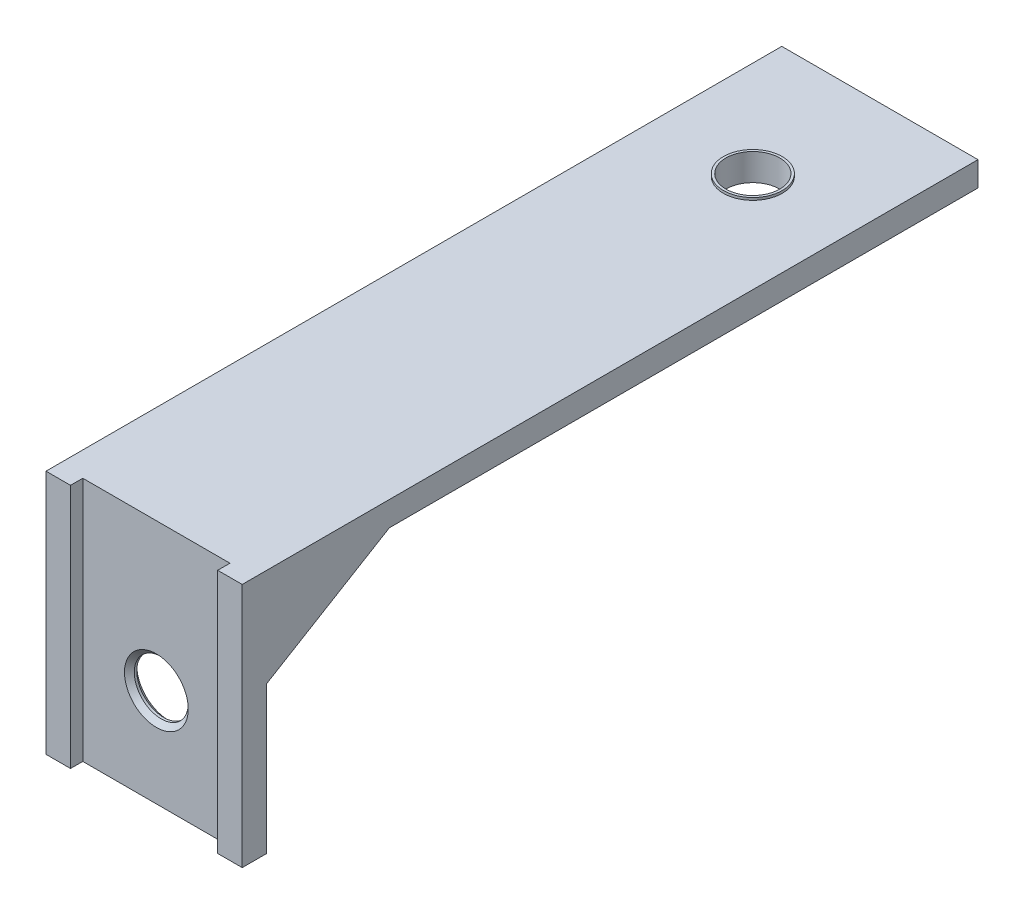
ISO-10303-21;
HEADER;
FILE_DESCRIPTION(('STEP AP214'),'2;1');
FILE_NAME('part.step','',(''),(''),'','','');
FILE_SCHEMA(('AUTOMOTIVE_DESIGN { 1 0 10303 214 1 1 1 1 }'));
ENDSEC;
DATA;
#1=APPLICATION_CONTEXT('core data for automotive mechanical design processes');
#2=APPLICATION_PROTOCOL_DEFINITION('international standard','automotive_design',2000,#1);
#3=PRODUCT_CONTEXT('',#1,'mechanical');
#4=PRODUCT('Part','Part','',(#3));
#5=PRODUCT_RELATED_PRODUCT_CATEGORY('part','',(#4));
#6=PRODUCT_DEFINITION_FORMATION('','',#4);
#7=PRODUCT_DEFINITION_CONTEXT('part definition',#1,'design');
#8=PRODUCT_DEFINITION('design','',#6,#7);
#9=PRODUCT_DEFINITION_SHAPE('','',#8);
#10=(LENGTH_UNIT() NAMED_UNIT(*) SI_UNIT(.MILLI.,.METRE.));
#11=(NAMED_UNIT(*) PLANE_ANGLE_UNIT() SI_UNIT($,.RADIAN.));
#12=(NAMED_UNIT(*) SI_UNIT($,.STERADIAN.) SOLID_ANGLE_UNIT());
#13=UNCERTAINTY_MEASURE_WITH_UNIT(LENGTH_MEASURE(1.E-05),#10,'distance_accuracy_value','');
#14=(GEOMETRIC_REPRESENTATION_CONTEXT(3) GLOBAL_UNCERTAINTY_ASSIGNED_CONTEXT((#13)) GLOBAL_UNIT_ASSIGNED_CONTEXT((#10,
#11,#12)) REPRESENTATION_CONTEXT('',''));
#15=CARTESIAN_POINT('',(0.,0.,0.));
#16=DIRECTION('',(0.,0.,1.));
#17=DIRECTION('',(1.,0.,0.));
#18=AXIS2_PLACEMENT_3D('',#15,#16,#17);
#19=CARTESIAN_POINT('',(40.,50.,0.));
#20=DIRECTION('',(0.,1.,0.));
#21=DIRECTION('',(0.,0.,1.));
#22=AXIS2_PLACEMENT_3D('',#19,#20,#21);
#23=PLANE('',#22);
#24=DIRECTION('',(-1.,0.,0.));
#25=VECTOR('',#24,1.);
#26=CARTESIAN_POINT('',(40.,50.,-150.));
#27=LINE('',#26,#25);
#28=CARTESIAN_POINT('',(40.,50.,-150.));
#29=VERTEX_POINT('',#28);
#30=CARTESIAN_POINT('',(0.,50.,-150.));
#31=VERTEX_POINT('',#30);
#32=EDGE_CURVE('E203',#29,#31,#27,.T.);
#33=ORIENTED_EDGE('',*,*,#32,.T.);
#34=DIRECTION('',(0.,0.,-1.));
#35=VECTOR('',#34,1.);
#36=CARTESIAN_POINT('',(0.,50.,0.));
#37=LINE('',#36,#35);
#38=CARTESIAN_POINT('',(0.,50.,0.));
#39=VERTEX_POINT('',#38);
#40=EDGE_CURVE('E178',#39,#31,#37,.T.);
#41=ORIENTED_EDGE('',*,*,#40,.F.);
#42=DIRECTION('',(-1.,0.,0.));
#43=VECTOR('',#42,1.);
#44=CARTESIAN_POINT('',(40.,50.,0.));
#45=LINE('',#44,#43);
#46=CARTESIAN_POINT('',(5.,50.,0.));
#47=VERTEX_POINT('',#46);
#48=EDGE_CURVE('E169',#47,#39,#45,.T.);
#49=ORIENTED_EDGE('',*,*,#48,.F.);
#50=DIRECTION('',(0.,0.,1.));
#51=VECTOR('',#50,1.);
#52=CARTESIAN_POINT('',(5.,50.,-2.5));
#53=LINE('',#52,#51);
#54=CARTESIAN_POINT('',(5.,50.,-2.5));
#55=VERTEX_POINT('',#54);
#56=EDGE_CURVE('E241',#55,#47,#53,.T.);
#57=ORIENTED_EDGE('',*,*,#56,.F.);
#58=DIRECTION('',(-1.,0.,0.));
#59=VECTOR('',#58,1.);
#60=CARTESIAN_POINT('',(35.,50.,-2.5));
#61=LINE('',#60,#59);
#62=CARTESIAN_POINT('',(35.,50.,-2.5));
#63=VERTEX_POINT('',#62);
#64=EDGE_CURVE('E233',#63,#55,#61,.T.);
#65=ORIENTED_EDGE('',*,*,#64,.F.);
#66=DIRECTION('',(0.,0.,-1.));
#67=VECTOR('',#66,1.);
#68=CARTESIAN_POINT('',(35.,50.,-2.5));
#69=LINE('',#68,#67);
#70=CARTESIAN_POINT('',(35.,50.,0.));
#71=VERTEX_POINT('',#70);
#72=EDGE_CURVE('E242',#71,#63,#69,.T.);
#73=ORIENTED_EDGE('',*,*,#72,.F.);
#74=CARTESIAN_POINT('',(40.,50.,0.));
#75=VERTEX_POINT('',#74);
#76=EDGE_CURVE('E206',#75,#71,#45,.T.);
#77=ORIENTED_EDGE('',*,*,#76,.F.);
#78=DIRECTION('',(0.,0.,-1.));
#79=VECTOR('',#78,1.);
#80=CARTESIAN_POINT('',(40.,50.,0.));
#81=LINE('',#80,#79);
#82=EDGE_CURVE('E264',#75,#29,#81,.T.);
#83=ORIENTED_EDGE('',*,*,#82,.T.);
#84=EDGE_LOOP('',(#33,#41,#49,#57,#65,#73,#77,#83));
#85=FACE_BOUND('',#84,.T.);
#86=CARTESIAN_POINT('',(20.,50.,-124.097336258444));
#87=DIRECTION('',(0.,1.,0.));
#88=DIRECTION('',(0.,0.,1.));
#89=AXIS2_PLACEMENT_3D('',#86,#87,#88);
#90=CIRCLE('',#89,6.);
#91=CARTESIAN_POINT('',(20.,50.,-118.097336258444));
#92=VERTEX_POINT('',#91);
#93=EDGE_CURVE('E354',#92,#92,#90,.T.);
#94=ORIENTED_EDGE('',*,*,#93,.F.);
#95=EDGE_LOOP('',(#94));
#96=FACE_BOUND('',#95,.T.);
#97=ADVANCED_FACE('F40',(#85,#96),#23,.T.);
#98=CARTESIAN_POINT('',(40.,0.,0.));
#99=DIRECTION('',(0.,0.,1.));
#100=DIRECTION('',(1.,0.,0.));
#101=AXIS2_PLACEMENT_3D('',#98,#99,#100);
#102=PLANE('',#101);
#103=DIRECTION('',(0.,1.,0.));
#104=VECTOR('',#103,1.);
#105=CARTESIAN_POINT('',(35.,0.,0.));
#106=LINE('',#105,#104);
#107=CARTESIAN_POINT('',(35.,0.,0.));
#108=VERTEX_POINT('',#107);
#109=EDGE_CURVE('E179',#108,#71,#106,.T.);
#110=ORIENTED_EDGE('',*,*,#109,.F.);
#111=DIRECTION('',(-1.,0.,0.));
#112=VECTOR('',#111,1.);
#113=CARTESIAN_POINT('',(40.,0.,0.));
#114=LINE('',#113,#112);
#115=CARTESIAN_POINT('',(40.,0.,0.));
#116=VERTEX_POINT('',#115);
#117=EDGE_CURVE('E191',#116,#108,#114,.T.);
#118=ORIENTED_EDGE('',*,*,#117,.F.);
#119=DIRECTION('',(0.,1.,0.));
#120=VECTOR('',#119,1.);
#121=CARTESIAN_POINT('',(40.,0.,0.));
#122=LINE('',#121,#120);
#123=EDGE_CURVE('E190',#116,#75,#122,.T.);
#124=ORIENTED_EDGE('',*,*,#123,.T.);
#125=ORIENTED_EDGE('',*,*,#76,.T.);
#126=EDGE_LOOP('',(#110,#118,#124,#125));
#127=FACE_BOUND('',#126,.T.);
#128=ADVANCED_FACE('F309',(#127),#102,.T.);
#129=DIRECTION('',(0.,1.,0.));
#130=VECTOR('',#129,1.);
#131=CARTESIAN_POINT('',(5.,0.,0.));
#132=LINE('',#131,#130);
#133=CARTESIAN_POINT('',(5.,0.,0.));
#134=VERTEX_POINT('',#133);
#135=EDGE_CURVE('E257',#134,#47,#132,.T.);
#136=ORIENTED_EDGE('',*,*,#135,.T.);
#137=ORIENTED_EDGE('',*,*,#48,.T.);
#138=DIRECTION('',(0.,1.,0.));
#139=VECTOR('',#138,1.);
#140=CARTESIAN_POINT('',(0.,0.,0.));
#141=LINE('',#140,#139);
#142=CARTESIAN_POINT('',(0.,0.,0.));
#143=VERTEX_POINT('',#142);
#144=EDGE_CURVE('E175',#143,#39,#141,.T.);
#145=ORIENTED_EDGE('',*,*,#144,.F.);
#146=EDGE_CURVE('E195',#134,#143,#114,.T.);
#147=ORIENTED_EDGE('',*,*,#146,.F.);
#148=EDGE_LOOP('',(#136,#137,#145,#147));
#149=FACE_BOUND('',#148,.T.);
#150=ADVANCED_FACE('F316',(#149),#102,.T.);
#151=CARTESIAN_POINT('',(40.,0.,0.));
#152=DIRECTION('',(0.,1.,0.));
#153=DIRECTION('',(0.,0.,1.));
#154=AXIS2_PLACEMENT_3D('',#151,#152,#153);
#155=PLANE('',#154);
#156=ORIENTED_EDGE('',*,*,#117,.T.);
#157=DIRECTION('',(0.,0.,-1.));
#158=VECTOR('',#157,1.);
#159=CARTESIAN_POINT('',(35.,0.,-2.5));
#160=LINE('',#159,#158);
#161=CARTESIAN_POINT('',(35.,0.,-2.5));
#162=VERTEX_POINT('',#161);
#163=EDGE_CURVE('E249',#108,#162,#160,.T.);
#164=ORIENTED_EDGE('',*,*,#163,.T.);
#165=DIRECTION('',(-1.,0.,0.));
#166=VECTOR('',#165,1.);
#167=CARTESIAN_POINT('',(35.,0.,-2.5));
#168=LINE('',#167,#166);
#169=CARTESIAN_POINT('',(5.,0.,-2.5));
#170=VERTEX_POINT('',#169);
#171=EDGE_CURVE('E252',#162,#170,#168,.T.);
#172=ORIENTED_EDGE('',*,*,#171,.T.);
#173=DIRECTION('',(0.,0.,1.));
#174=VECTOR('',#173,1.);
#175=CARTESIAN_POINT('',(5.,0.,-2.5));
#176=LINE('',#175,#174);
#177=EDGE_CURVE('E261',#170,#134,#176,.T.);
#178=ORIENTED_EDGE('',*,*,#177,.T.);
#179=ORIENTED_EDGE('',*,*,#146,.T.);
#180=DIRECTION('',(0.,0.,-1.));
#181=VECTOR('',#180,1.);
#182=CARTESIAN_POINT('',(0.,0.,0.));
#183=LINE('',#182,#181);
#184=CARTESIAN_POINT('',(0.,0.,-5.));
#185=VERTEX_POINT('',#184);
#186=EDGE_CURVE('E188',#143,#185,#183,.T.);
#187=ORIENTED_EDGE('',*,*,#186,.T.);
#188=DIRECTION('',(-1.,0.,0.));
#189=VECTOR('',#188,1.);
#190=CARTESIAN_POINT('',(40.,0.,-5.));
#191=LINE('',#190,#189);
#192=CARTESIAN_POINT('',(40.,0.,-5.));
#193=VERTEX_POINT('',#192);
#194=EDGE_CURVE('E196',#193,#185,#191,.T.);
#195=ORIENTED_EDGE('',*,*,#194,.F.);
#196=DIRECTION('',(0.,0.,-1.));
#197=VECTOR('',#196,1.);
#198=CARTESIAN_POINT('',(40.,0.,0.));
#199=LINE('',#198,#197);
#200=EDGE_CURVE('E165',#116,#193,#199,.T.);
#201=ORIENTED_EDGE('',*,*,#200,.F.);
#202=EDGE_LOOP('',(#156,#164,#172,#178,#179,#187,#195,#201));
#203=FACE_BOUND('',#202,.T.);
#204=ADVANCED_FACE('F311',(#203),#155,.F.);
#205=CARTESIAN_POINT('',(40.,0.,-5.));
#206=DIRECTION('',(0.,0.,1.));
#207=DIRECTION('',(1.,0.,0.));
#208=AXIS2_PLACEMENT_3D('',#205,#206,#207);
#209=PLANE('',#208);
#210=CARTESIAN_POINT('',(20.,20.,-5.));
#211=DIRECTION('',(0.,0.,1.));
#212=DIRECTION('',(1.,0.,0.));
#213=AXIS2_PLACEMENT_3D('',#210,#211,#212);
#214=CIRCLE('',#213,6.50000000000005);
#215=CARTESIAN_POINT('',(13.5,20.,-5.));
#216=VERTEX_POINT('',#215);
#217=EDGE_CURVE('E11',#216,#216,#214,.T.);
#218=ORIENTED_EDGE('',*,*,#217,.T.);
#219=EDGE_LOOP('',(#218));
#220=FACE_BOUND('',#219,.T.);
#221=DIRECTION('',(0.,1.,0.));
#222=VECTOR('',#221,1.);
#223=CARTESIAN_POINT('',(0.,0.,-5.));
#224=LINE('',#223,#222);
#225=CARTESIAN_POINT('',(0.,30.,-5.));
#226=VERTEX_POINT('',#225);
#227=EDGE_CURVE('E186',#185,#226,#224,.T.);
#228=ORIENTED_EDGE('',*,*,#227,.T.);
#229=DIRECTION('',(-1.,0.,0.));
#230=VECTOR('',#229,1.);
#231=CARTESIAN_POINT('',(0.,30.,-5.));
#232=LINE('',#231,#230);
#233=CARTESIAN_POINT('',(5.,30.,-5.));
#234=VERTEX_POINT('',#233);
#235=EDGE_CURVE('E55',#234,#226,#232,.T.);
#236=ORIENTED_EDGE('',*,*,#235,.F.);
#237=DIRECTION('',(0.,1.,0.));
#238=VECTOR('',#237,1.);
#239=CARTESIAN_POINT('',(5.,25.,-5.));
#240=LINE('',#239,#238);
#241=CARTESIAN_POINT('',(5.,45.,-5.));
#242=VERTEX_POINT('',#241);
#243=EDGE_CURVE('E288',#234,#242,#240,.T.);
#244=ORIENTED_EDGE('',*,*,#243,.T.);
#245=DIRECTION('',(-1.,0.,0.));
#246=VECTOR('',#245,1.);
#247=CARTESIAN_POINT('',(40.,45.,-5.));
#248=LINE('',#247,#246);
#249=CARTESIAN_POINT('',(35.,45.,-5.));
#250=VERTEX_POINT('',#249);
#251=EDGE_CURVE('E198',#250,#242,#248,.T.);
#252=ORIENTED_EDGE('',*,*,#251,.F.);
#253=DIRECTION('',(0.,1.,0.));
#254=VECTOR('',#253,1.);
#255=CARTESIAN_POINT('',(35.,25.,-5.));
#256=LINE('',#255,#254);
#257=CARTESIAN_POINT('',(35.,30.,-5.));
#258=VERTEX_POINT('',#257);
#259=EDGE_CURVE('E160',#258,#250,#256,.T.);
#260=ORIENTED_EDGE('',*,*,#259,.F.);
#261=DIRECTION('',(1.,0.,0.));
#262=VECTOR('',#261,1.);
#263=CARTESIAN_POINT('',(40.,30.,-5.));
#264=LINE('',#263,#262);
#265=CARTESIAN_POINT('',(40.,30.,-5.));
#266=VERTEX_POINT('',#265);
#267=EDGE_CURVE('E146',#258,#266,#264,.T.);
#268=ORIENTED_EDGE('',*,*,#267,.T.);
#269=DIRECTION('',(0.,1.,0.));
#270=VECTOR('',#269,1.);
#271=CARTESIAN_POINT('',(40.,0.,-5.));
#272=LINE('',#271,#270);
#273=EDGE_CURVE('E158',#193,#266,#272,.T.);
#274=ORIENTED_EDGE('',*,*,#273,.F.);
#275=ORIENTED_EDGE('',*,*,#194,.T.);
#276=EDGE_LOOP('',(#228,#236,#244,#252,#260,#268,#274,#275));
#277=FACE_BOUND('',#276,.T.);
#278=ADVANCED_FACE('F156',(#220,#277),#209,.F.);
#279=CARTESIAN_POINT('',(40.,45.,-5.));
#280=DIRECTION('',(0.,1.,0.));
#281=DIRECTION('',(0.,0.,1.));
#282=AXIS2_PLACEMENT_3D('',#279,#280,#281);
#283=PLANE('',#282);
#284=CARTESIAN_POINT('',(20.,45.,-124.097336258444));
#285=DIRECTION('',(0.,1.,0.));
#286=DIRECTION('',(0.,0.,1.));
#287=AXIS2_PLACEMENT_3D('',#284,#285,#286);
#288=CIRCLE('',#287,5.5);
#289=CARTESIAN_POINT('',(20.,45.,-118.597336258444));
#290=VERTEX_POINT('',#289);
#291=EDGE_CURVE('E292',#290,#290,#288,.T.);
#292=ORIENTED_EDGE('',*,*,#291,.T.);
#293=EDGE_LOOP('',(#292));
#294=FACE_BOUND('',#293,.T.);
#295=DIRECTION('',(0.,0.,1.));
#296=VECTOR('',#295,1.);
#297=CARTESIAN_POINT('',(5.,45.,-5.));
#298=LINE('',#297,#296);
#299=CARTESIAN_POINT('',(5.,45.,-30.));
#300=VERTEX_POINT('',#299);
#301=EDGE_CURVE('E63',#300,#242,#298,.T.);
#302=ORIENTED_EDGE('',*,*,#301,.F.);
#303=DIRECTION('',(-1.,0.,0.));
#304=VECTOR('',#303,1.);
#305=CARTESIAN_POINT('',(40.,45.,-30.));
#306=LINE('',#305,#304);
#307=CARTESIAN_POINT('',(0.,45.,-30.));
#308=VERTEX_POINT('',#307);
#309=EDGE_CURVE('E275',#300,#308,#306,.T.);
#310=ORIENTED_EDGE('',*,*,#309,.T.);
#311=DIRECTION('',(0.,0.,-1.));
#312=VECTOR('',#311,1.);
#313=CARTESIAN_POINT('',(0.,45.,-5.));
#314=LINE('',#313,#312);
#315=CARTESIAN_POINT('',(0.,45.,-150.));
#316=VERTEX_POINT('',#315);
#317=EDGE_CURVE('E184',#308,#316,#314,.T.);
#318=ORIENTED_EDGE('',*,*,#317,.T.);
#319=DIRECTION('',(-1.,0.,0.));
#320=VECTOR('',#319,1.);
#321=CARTESIAN_POINT('',(40.,45.,-150.));
#322=LINE('',#321,#320);
#323=CARTESIAN_POINT('',(40.,45.,-150.));
#324=VERTEX_POINT('',#323);
#325=EDGE_CURVE('E200',#324,#316,#322,.T.);
#326=ORIENTED_EDGE('',*,*,#325,.F.);
#327=DIRECTION('',(0.,0.,-1.));
#328=VECTOR('',#327,1.);
#329=CARTESIAN_POINT('',(40.,45.,-5.));
#330=LINE('',#329,#328);
#331=CARTESIAN_POINT('',(40.,45.,-30.));
#332=VERTEX_POINT('',#331);
#333=EDGE_CURVE('E167',#332,#324,#330,.T.);
#334=ORIENTED_EDGE('',*,*,#333,.F.);
#335=DIRECTION('',(1.,0.,0.));
#336=VECTOR('',#335,1.);
#337=CARTESIAN_POINT('',(40.,45.,-30.));
#338=LINE('',#337,#336);
#339=CARTESIAN_POINT('',(35.,45.,-30.));
#340=VERTEX_POINT('',#339);
#341=EDGE_CURVE('E149',#332,#340,#338,.F.);
#342=ORIENTED_EDGE('',*,*,#341,.T.);
#343=DIRECTION('',(0.,0.,-1.));
#344=VECTOR('',#343,1.);
#345=CARTESIAN_POINT('',(35.,45.,-5.));
#346=LINE('',#345,#344);
#347=EDGE_CURVE('E300',#250,#340,#346,.T.);
#348=ORIENTED_EDGE('',*,*,#347,.F.);
#349=ORIENTED_EDGE('',*,*,#251,.T.);
#350=EDGE_LOOP('',(#302,#310,#318,#326,#334,#342,#348,#349));
#351=FACE_BOUND('',#350,.T.);
#352=ADVANCED_FACE('F273',(#294,#351),#283,.F.);
#353=CARTESIAN_POINT('',(40.,50.,-150.));
#354=DIRECTION('',(0.,0.,-1.));
#355=DIRECTION('',(-1.,0.,0.));
#356=AXIS2_PLACEMENT_3D('',#353,#354,#355);
#357=PLANE('',#356);
#358=DIRECTION('',(0.,-1.,0.));
#359=VECTOR('',#358,1.);
#360=CARTESIAN_POINT('',(0.,50.,-150.));
#361=LINE('',#360,#359);
#362=EDGE_CURVE('E181',#31,#316,#361,.T.);
#363=ORIENTED_EDGE('',*,*,#362,.F.);
#364=ORIENTED_EDGE('',*,*,#32,.F.);
#365=DIRECTION('',(0.,-1.,0.));
#366=VECTOR('',#365,1.);
#367=CARTESIAN_POINT('',(40.,50.,-150.));
#368=LINE('',#367,#366);
#369=EDGE_CURVE('E171',#29,#324,#368,.T.);
#370=ORIENTED_EDGE('',*,*,#369,.T.);
#371=ORIENTED_EDGE('',*,*,#325,.T.);
#372=EDGE_LOOP('',(#363,#364,#370,#371));
#373=FACE_BOUND('',#372,.T.);
#374=ADVANCED_FACE('F270',(#373),#357,.T.);
#375=CARTESIAN_POINT('',(40.,0.,0.));
#376=DIRECTION('',(-1.,0.,0.));
#377=DIRECTION('',(0.,0.,1.));
#378=AXIS2_PLACEMENT_3D('',#375,#376,#377);
#379=PLANE('',#378);
#380=DIRECTION('',(0.,-0.514495755427526,0.857492925712544));
#381=VECTOR('',#380,1.);
#382=CARTESIAN_POINT('',(40.,45.,-30.));
#383=LINE('',#382,#381);
#384=EDGE_CURVE('E142',#332,#266,#383,.T.);
#385=ORIENTED_EDGE('',*,*,#384,.F.);
#386=ORIENTED_EDGE('',*,*,#333,.T.);
#387=ORIENTED_EDGE('',*,*,#369,.F.);
#388=ORIENTED_EDGE('',*,*,#82,.F.);
#389=ORIENTED_EDGE('',*,*,#123,.F.);
#390=ORIENTED_EDGE('',*,*,#200,.T.);
#391=ORIENTED_EDGE('',*,*,#273,.T.);
#392=EDGE_LOOP('',(#385,#386,#387,#388,#389,#390,#391));
#393=FACE_BOUND('',#392,.T.);
#394=ADVANCED_FACE('F162',(#393),#379,.F.);
#395=CARTESIAN_POINT('',(0.,0.,0.));
#396=DIRECTION('',(-1.,0.,0.));
#397=DIRECTION('',(0.,0.,1.));
#398=AXIS2_PLACEMENT_3D('',#395,#396,#397);
#399=PLANE('',#398);
#400=ORIENTED_EDGE('',*,*,#317,.F.);
#401=DIRECTION('',(0.,-0.514495755427526,0.857492925712544));
#402=VECTOR('',#401,1.);
#403=CARTESIAN_POINT('',(0.,45.,-30.));
#404=LINE('',#403,#402);
#405=EDGE_CURVE('E281',#308,#226,#404,.T.);
#406=ORIENTED_EDGE('',*,*,#405,.T.);
#407=ORIENTED_EDGE('',*,*,#227,.F.);
#408=ORIENTED_EDGE('',*,*,#186,.F.);
#409=ORIENTED_EDGE('',*,*,#144,.T.);
#410=ORIENTED_EDGE('',*,*,#40,.T.);
#411=ORIENTED_EDGE('',*,*,#362,.T.);
#412=EDGE_LOOP('',(#400,#406,#407,#408,#409,#410,#411));
#413=FACE_BOUND('',#412,.T.);
#414=ADVANCED_FACE('F279',(#413),#399,.T.);
#415=CARTESIAN_POINT('',(35.,0.,-2.5));
#416=DIRECTION('',(1.,0.,0.));
#417=DIRECTION('',(0.,0.,-1.));
#418=AXIS2_PLACEMENT_3D('',#415,#416,#417);
#419=PLANE('',#418);
#420=ORIENTED_EDGE('',*,*,#72,.T.);
#421=DIRECTION('',(0.,1.,0.));
#422=VECTOR('',#421,1.);
#423=CARTESIAN_POINT('',(35.,0.,-2.5));
#424=LINE('',#423,#422);
#425=EDGE_CURVE('E238',#162,#63,#424,.T.);
#426=ORIENTED_EDGE('',*,*,#425,.F.);
#427=ORIENTED_EDGE('',*,*,#163,.F.);
#428=ORIENTED_EDGE('',*,*,#109,.T.);
#429=EDGE_LOOP('',(#420,#426,#427,#428));
#430=FACE_BOUND('',#429,.T.);
#431=ADVANCED_FACE('F306',(#430),#419,.F.);
#432=CARTESIAN_POINT('',(5.,0.,-2.5));
#433=DIRECTION('',(-1.,0.,0.));
#434=DIRECTION('',(0.,0.,1.));
#435=AXIS2_PLACEMENT_3D('',#432,#433,#434);
#436=PLANE('',#435);
#437=ORIENTED_EDGE('',*,*,#56,.T.);
#438=ORIENTED_EDGE('',*,*,#135,.F.);
#439=ORIENTED_EDGE('',*,*,#177,.F.);
#440=DIRECTION('',(0.,1.,0.));
#441=VECTOR('',#440,1.);
#442=CARTESIAN_POINT('',(5.,0.,-2.5));
#443=LINE('',#442,#441);
#444=EDGE_CURVE('E236',#170,#55,#443,.T.);
#445=ORIENTED_EDGE('',*,*,#444,.T.);
#446=EDGE_LOOP('',(#437,#438,#439,#445));
#447=FACE_BOUND('',#446,.T.);
#448=ADVANCED_FACE('F228',(#447),#436,.F.);
#449=CARTESIAN_POINT('',(35.,0.,-2.5));
#450=DIRECTION('',(0.,0.,-1.));
#451=DIRECTION('',(-1.,0.,0.));
#452=AXIS2_PLACEMENT_3D('',#449,#450,#451);
#453=PLANE('',#452);
#454=CARTESIAN_POINT('',(20.,20.,-2.5));
#455=DIRECTION('',(0.,0.,-1.));
#456=DIRECTION('',(-1.,0.,0.));
#457=AXIS2_PLACEMENT_3D('',#454,#455,#456);
#458=CIRCLE('',#457,6.49999999999999);
#459=CARTESIAN_POINT('',(13.5,20.,-2.5));
#460=VERTEX_POINT('',#459);
#461=EDGE_CURVE('E194',#460,#460,#458,.T.);
#462=ORIENTED_EDGE('',*,*,#461,.T.);
#463=EDGE_LOOP('',(#462));
#464=FACE_BOUND('',#463,.T.);
#465=ORIENTED_EDGE('',*,*,#64,.T.);
#466=ORIENTED_EDGE('',*,*,#444,.F.);
#467=ORIENTED_EDGE('',*,*,#171,.F.);
#468=ORIENTED_EDGE('',*,*,#425,.T.);
#469=EDGE_LOOP('',(#465,#466,#467,#468));
#470=FACE_BOUND('',#469,.T.);
#471=ADVANCED_FACE('F224',(#464,#470),#453,.F.);
#472=CARTESIAN_POINT('',(35.,25.,-75.));
#473=DIRECTION('',(1.,0.,0.));
#474=DIRECTION('',(0.,0.,-1.));
#475=AXIS2_PLACEMENT_3D('',#472,#473,#474);
#476=PLANE('',#475);
#477=ORIENTED_EDGE('',*,*,#259,.T.);
#478=ORIENTED_EDGE('',*,*,#347,.T.);
#479=DIRECTION('',(0.,-0.514495755427526,0.857492925712544));
#480=VECTOR('',#479,1.);
#481=CARTESIAN_POINT('',(35.,45.,-30.));
#482=LINE('',#481,#480);
#483=EDGE_CURVE('E153',#340,#258,#482,.T.);
#484=ORIENTED_EDGE('',*,*,#483,.T.);
#485=EDGE_LOOP('',(#477,#478,#484));
#486=FACE_BOUND('',#485,.T.);
#487=ADVANCED_FACE('F227',(#486),#476,.F.);
#488=CARTESIAN_POINT('',(40.,45.,-30.));
#489=DIRECTION('',(0.,0.857492925712544,0.514495755427526));
#490=DIRECTION('',(0.,-0.514495755427526,0.857492925712544));
#491=AXIS2_PLACEMENT_3D('',#488,#489,#490);
#492=PLANE('',#491);
#493=ORIENTED_EDGE('',*,*,#341,.F.);
#494=ORIENTED_EDGE('',*,*,#384,.T.);
#495=ORIENTED_EDGE('',*,*,#267,.F.);
#496=ORIENTED_EDGE('',*,*,#483,.F.);
#497=EDGE_LOOP('',(#493,#494,#495,#496));
#498=FACE_BOUND('',#497,.T.);
#499=ADVANCED_FACE('F144',(#498),#492,.F.);
#500=CARTESIAN_POINT('',(5.,25.,-75.));
#501=DIRECTION('',(-1.,0.,0.));
#502=DIRECTION('',(0.,0.,1.));
#503=AXIS2_PLACEMENT_3D('',#500,#501,#502);
#504=PLANE('',#503);
#505=DIRECTION('',(0.,-0.514495755427526,0.857492925712544));
#506=VECTOR('',#505,1.);
#507=CARTESIAN_POINT('',(5.,45.,-30.));
#508=LINE('',#507,#506);
#509=EDGE_CURVE('E285',#300,#234,#508,.T.);
#510=ORIENTED_EDGE('',*,*,#509,.F.);
#511=ORIENTED_EDGE('',*,*,#301,.T.);
#512=ORIENTED_EDGE('',*,*,#243,.F.);
#513=EDGE_LOOP('',(#510,#511,#512));
#514=FACE_BOUND('',#513,.T.);
#515=ADVANCED_FACE('F380',(#514),#504,.F.);
#516=CARTESIAN_POINT('',(0.,45.,-30.));
#517=DIRECTION('',(0.,-0.857492925712544,-0.514495755427526));
#518=DIRECTION('',(0.,-0.514495755427526,0.857492925712544));
#519=AXIS2_PLACEMENT_3D('',#516,#517,#518);
#520=PLANE('',#519);
#521=ORIENTED_EDGE('',*,*,#309,.F.);
#522=ORIENTED_EDGE('',*,*,#509,.T.);
#523=ORIENTED_EDGE('',*,*,#235,.T.);
#524=ORIENTED_EDGE('',*,*,#405,.F.);
#525=EDGE_LOOP('',(#521,#522,#523,#524));
#526=FACE_BOUND('',#525,.T.);
#527=ADVANCED_FACE('F283',(#526),#520,.T.);
#528=CARTESIAN_POINT('',(20.,20.,5.));
#529=DIRECTION('',(0.,0.,-1.));
#530=DIRECTION('',(-1.,0.,0.));
#531=AXIS2_PLACEMENT_3D('',#528,#529,#530);
#532=CYLINDRICAL_SURFACE('',#531,5.5);
#533=CARTESIAN_POINT('',(20.,20.,-3.49999999999998));
#534=DIRECTION('',(0.,0.,-1.));
#535=DIRECTION('',(-1.,0.,0.));
#536=AXIS2_PLACEMENT_3D('',#533,#534,#535);
#537=CIRCLE('',#536,5.5);
#538=CARTESIAN_POINT('',(14.5,20.,-3.49999999999998));
#539=VERTEX_POINT('',#538);
#540=EDGE_CURVE('E48',#539,#539,#537,.F.);
#541=ORIENTED_EDGE('',*,*,#540,.T.);
#542=EDGE_LOOP('',(#541));
#543=FACE_BOUND('',#542,.T.);
#544=CARTESIAN_POINT('',(20.,20.,-3.99999999999996));
#545=DIRECTION('',(0.,0.,1.));
#546=DIRECTION('',(1.,0.,0.));
#547=AXIS2_PLACEMENT_3D('',#544,#545,#546);
#548=CIRCLE('',#547,5.5);
#549=CARTESIAN_POINT('',(14.5,20.,-3.99999999999996));
#550=VERTEX_POINT('',#549);
#551=EDGE_CURVE('E211',#550,#550,#548,.F.);
#552=ORIENTED_EDGE('',*,*,#551,.T.);
#553=EDGE_LOOP('',(#552));
#554=FACE_BOUND('',#553,.T.);
#555=ADVANCED_FACE('F216',(#543,#554),#532,.F.);
#556=CARTESIAN_POINT('',(20.,20.,-2.5));
#557=DIRECTION('',(0.,0.,1.));
#558=DIRECTION('',(1.,0.,0.));
#559=AXIS2_PLACEMENT_3D('',#556,#557,#558);
#560=CONICAL_SURFACE('',#559,6.49999999999999,0.785398163397451);
#561=ORIENTED_EDGE('',*,*,#540,.F.);
#562=EDGE_LOOP('',(#561));
#563=FACE_BOUND('',#562,.T.);
#564=ORIENTED_EDGE('',*,*,#461,.F.);
#565=EDGE_LOOP('',(#564));
#566=FACE_BOUND('',#565,.T.);
#567=ADVANCED_FACE('F219',(#563,#566),#560,.F.);
#568=CARTESIAN_POINT('',(20.,20.,-3.99999999999996));
#569=DIRECTION('',(0.,0.,-1.));
#570=DIRECTION('',(-1.,0.,0.));
#571=AXIS2_PLACEMENT_3D('',#568,#569,#570);
#572=CONICAL_SURFACE('',#571,5.5,0.785398163397453);
#573=CARTESIAN_POINT('',(13.5,20.,-5.));
#574=CARTESIAN_POINT('',(13.5104166666666,20.,-4.98958333333333));
#575=CARTESIAN_POINT('',(13.5208333333333,20.,-4.97916666666667));
#576=CARTESIAN_POINT('',(13.5416666666666,20.,-4.95833333333333));
#577=CARTESIAN_POINT('',(13.5520833333333,20.,-4.94791666666667));
#578=CARTESIAN_POINT('',(13.5729166666666,20.,-4.92708333333333));
#579=CARTESIAN_POINT('',(13.5833333333333,20.,-4.91666666666666));
#580=CARTESIAN_POINT('',(13.6041666666666,20.,-4.89583333333333));
#581=CARTESIAN_POINT('',(13.6145833333333,20.,-4.88541666666666));
#582=CARTESIAN_POINT('',(13.6354166666666,20.,-4.86458333333333));
#583=CARTESIAN_POINT('',(13.6458333333333,20.,-4.85416666666666));
#584=CARTESIAN_POINT('',(13.6666666666666,20.,-4.83333333333333));
#585=CARTESIAN_POINT('',(13.6770833333333,20.,-4.82291666666666));
#586=CARTESIAN_POINT('',(13.6979166666666,20.,-4.80208333333333));
#587=CARTESIAN_POINT('',(13.7083333333333,20.,-4.79166666666666));
#588=CARTESIAN_POINT('',(13.7291666666666,20.,-4.77083333333333));
#589=CARTESIAN_POINT('',(13.7395833333333,20.,-4.76041666666666));
#590=CARTESIAN_POINT('',(13.7604166666666,20.,-4.73958333333332));
#591=CARTESIAN_POINT('',(13.7708333333333,20.,-4.72916666666666));
#592=CARTESIAN_POINT('',(13.7916666666666,20.,-4.70833333333332));
#593=CARTESIAN_POINT('',(13.8020833333333,20.,-4.69791666666666));
#594=CARTESIAN_POINT('',(13.8229166666666,20.,-4.67708333333332));
#595=CARTESIAN_POINT('',(13.8333333333333,20.,-4.66666666666665));
#596=CARTESIAN_POINT('',(13.8541666666666,20.,-4.64583333333332));
#597=CARTESIAN_POINT('',(13.8645833333333,20.,-4.63541666666665));
#598=CARTESIAN_POINT('',(13.8854166666666,20.,-4.61458333333332));
#599=CARTESIAN_POINT('',(13.8958333333333,20.,-4.60416666666665));
#600=CARTESIAN_POINT('',(13.9166666666666,20.,-4.58333333333332));
#601=CARTESIAN_POINT('',(13.9270833333333,20.,-4.57291666666665));
#602=CARTESIAN_POINT('',(13.9479166666666,20.,-4.55208333333332));
#603=CARTESIAN_POINT('',(13.9583333333333,20.,-4.54166666666665));
#604=CARTESIAN_POINT('',(13.9791666666666,20.,-4.52083333333332));
#605=CARTESIAN_POINT('',(13.9895833333333,20.,-4.51041666666665));
#606=CARTESIAN_POINT('',(14.0104166666666,20.,-4.48958333333331));
#607=CARTESIAN_POINT('',(14.0208333333333,20.,-4.47916666666665));
#608=CARTESIAN_POINT('',(14.0416666666666,20.,-4.45833333333331));
#609=CARTESIAN_POINT('',(14.0520833333333,20.,-4.44791666666665));
#610=CARTESIAN_POINT('',(14.0729166666666,20.,-4.42708333333331));
#611=CARTESIAN_POINT('',(14.0833333333333,20.,-4.41666666666664));
#612=CARTESIAN_POINT('',(14.1041666666666,20.,-4.39583333333331));
#613=CARTESIAN_POINT('',(14.1145833333333,20.,-4.38541666666664));
#614=CARTESIAN_POINT('',(14.1354166666666,20.,-4.36458333333331));
#615=CARTESIAN_POINT('',(14.1458333333333,20.,-4.35416666666664));
#616=CARTESIAN_POINT('',(14.1666666666666,20.,-4.33333333333331));
#617=CARTESIAN_POINT('',(14.1770833333333,20.,-4.32291666666664));
#618=CARTESIAN_POINT('',(14.1979166666666,20.,-4.30208333333331));
#619=CARTESIAN_POINT('',(14.2083333333333,20.,-4.29166666666664));
#620=CARTESIAN_POINT('',(14.2291666666667,20.,-4.27083333333331));
#621=CARTESIAN_POINT('',(14.2395833333333,20.,-4.26041666666664));
#622=CARTESIAN_POINT('',(14.2604166666667,20.,-4.2395833333333));
#623=CARTESIAN_POINT('',(14.2708333333333,20.,-4.22916666666664));
#624=CARTESIAN_POINT('',(14.2916666666667,20.,-4.2083333333333));
#625=CARTESIAN_POINT('',(14.3020833333333,20.,-4.19791666666664));
#626=CARTESIAN_POINT('',(14.3229166666667,20.,-4.1770833333333));
#627=CARTESIAN_POINT('',(14.3333333333333,20.,-4.16666666666663));
#628=CARTESIAN_POINT('',(14.3541666666667,20.,-4.1458333333333));
#629=CARTESIAN_POINT('',(14.3645833333333,20.,-4.13541666666663));
#630=CARTESIAN_POINT('',(14.3854166666667,20.,-4.1145833333333));
#631=CARTESIAN_POINT('',(14.3958333333333,20.,-4.10416666666663));
#632=CARTESIAN_POINT('',(14.4166666666667,20.,-4.0833333333333));
#633=CARTESIAN_POINT('',(14.4270833333333,20.,-4.07291666666663));
#634=CARTESIAN_POINT('',(14.4479166666667,20.,-4.0520833333333));
#635=CARTESIAN_POINT('',(14.4583333333333,20.,-4.04166666666663));
#636=CARTESIAN_POINT('',(14.4791666666667,20.,-4.0208333333333));
#637=CARTESIAN_POINT('',(14.4895833333333,20.,-4.01041666666663));
#638=CARTESIAN_POINT('',(14.5,20.,-3.99999999999996));
#639=B_SPLINE_CURVE_WITH_KNOTS('',3,(#573,#574,#575,#576,#577,#578,#579,#580,#581,#582,#583,
#584,#585,#586,#587,#588,#589,#590,#591,#592,#593,#594,#595,#596,#597,#598,#599,#600,#601,#602,
#603,#604,#605,#606,#607,#608,#609,#610,#611,#612,#613,#614,#615,#616,#617,#618,#619,#620,#621,
#622,#623,#624,#625,#626,#627,#628,#629,#630,#631,#632,#633,#634,#635,#636,#637,#638),
.UNSPECIFIED.,.F.,.F.,(4,2,2,2,2,2,2,2,2,2,2,2,2,2,2,2,2,2,2,2,2,2,2,2,2,2,2,2,2,2,2,2,4),(0.,
0.0441941738241599,0.0883883476483222,0.132582521472483,0.176776695296644,0.220970869120805,
0.265165042944967,0.309359216769128,0.353553390593288,0.397747564417451,0.44194173824161,
0.486135912065772,0.530330085889933,0.574524259714094,0.618718433538256,0.662912607362416,
0.707106781186578,0.751300955010739,0.7954951288349,0.839689302659061,0.883883476483221,
0.928077650307384,0.972271824131544,1.01646599795571,1.06066017177987,1.10485434560403,
1.14904851942819,1.19324269325235,1.23743686707651,1.28163104090067,1.32582521472483,
1.37001938854899,1.41421356237316),.UNSPECIFIED.);
#640=EDGE_CURVE('BSEAM42',#216,#550,#639,.T.);
#641=ORIENTED_EDGE('',*,*,#217,.F.);
#642=ORIENTED_EDGE('',*,*,#551,.F.);
#643=ORIENTED_EDGE('',*,*,#640,.T.);
#644=ORIENTED_EDGE('',*,*,#640,.F.);
#645=EDGE_LOOP('',(#641,#643,#642,#644));
#646=FACE_BOUND('',#645,.T.);
#647=ADVANCED_FACE('F42',(#646),#572,.F.);
#648=CARTESIAN_POINT('',(20.,40.,-124.097336258444));
#649=DIRECTION('',(0.,1.,0.));
#650=DIRECTION('',(0.,0.,1.));
#651=AXIS2_PLACEMENT_3D('',#648,#649,#650);
#652=CYLINDRICAL_SURFACE('',#651,5.5);
#653=ORIENTED_EDGE('',*,*,#291,.F.);
#654=EDGE_LOOP('',(#653));
#655=FACE_BOUND('',#654,.T.);
#656=CARTESIAN_POINT('',(20.,50.5,-124.097336258444));
#657=DIRECTION('',(0.,1.,0.));
#658=DIRECTION('',(0.,0.,1.));
#659=AXIS2_PLACEMENT_3D('',#656,#657,#658);
#660=CIRCLE('',#659,5.50000000000001);
#661=CARTESIAN_POINT('',(20.,50.5,-118.597336258444));
#662=VERTEX_POINT('',#661);
#663=EDGE_CURVE('E359',#662,#662,#660,.T.);
#664=ORIENTED_EDGE('',*,*,#663,.T.);
#665=EDGE_LOOP('',(#664));
#666=FACE_BOUND('',#665,.T.);
#667=ADVANCED_FACE('F364',(#655,#666),#652,.F.);
#668=CARTESIAN_POINT('',(20.,50.5,-124.097336258444));
#669=DIRECTION('',(0.,1.,0.));
#670=DIRECTION('',(0.,0.,1.));
#671=AXIS2_PLACEMENT_3D('',#668,#669,#670);
#672=PLANE('',#671);
#673=CARTESIAN_POINT('',(20.,50.5,-124.097336258444));
#674=DIRECTION('',(0.,1.,0.));
#675=DIRECTION('',(0.,0.,1.));
#676=AXIS2_PLACEMENT_3D('',#673,#674,#675);
#677=CIRCLE('',#676,6.);
#678=CARTESIAN_POINT('',(20.,50.5,-118.097336258444));
#679=VERTEX_POINT('',#678);
#680=EDGE_CURVE('E352',#679,#679,#677,.T.);
#681=ORIENTED_EDGE('',*,*,#680,.T.);
#682=EDGE_LOOP('',(#681));
#683=FACE_BOUND('',#682,.T.);
#684=ORIENTED_EDGE('',*,*,#663,.F.);
#685=EDGE_LOOP('',(#684));
#686=FACE_BOUND('',#685,.T.);
#687=ADVANCED_FACE('F366',(#683,#686),#672,.T.);
#688=CARTESIAN_POINT('',(20.,50.5,-124.097336258444));
#689=DIRECTION('',(0.,-1.,0.));
#690=DIRECTION('',(0.,0.,-1.));
#691=AXIS2_PLACEMENT_3D('',#688,#689,#690);
#692=CYLINDRICAL_SURFACE('',#691,6.);
#693=ORIENTED_EDGE('',*,*,#680,.F.);
#694=EDGE_LOOP('',(#693));
#695=FACE_BOUND('',#694,.T.);
#696=ORIENTED_EDGE('',*,*,#93,.T.);
#697=EDGE_LOOP('',(#696));
#698=FACE_BOUND('',#697,.T.);
#699=ADVANCED_FACE('F368',(#695,#698),#692,.T.);
#700=CLOSED_SHELL('',(#97,#128,#150,#204,#278,#352,#374,#394,#414,#431,#448,#471,#487,#499,#515,
#527,#555,#567,#647,#667,#687,#699));
#701=MANIFOLD_SOLID_BREP('B2',#700);
#702=ADVANCED_BREP_SHAPE_REPRESENTATION('',(#18,#701),#14);
#703=SHAPE_DEFINITION_REPRESENTATION(#9,#702);
ENDSEC;
END-ISO-10303-21;
